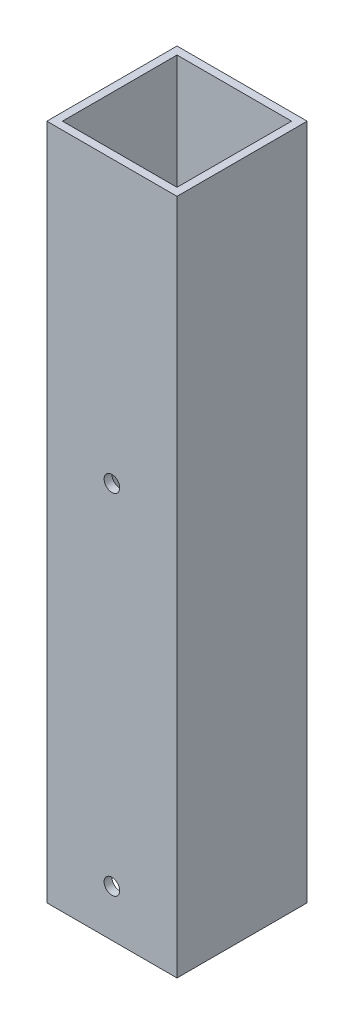
ISO-10303-21;
HEADER;
FILE_DESCRIPTION(('STEP AP214'),'2;1');
FILE_NAME('part.step','',(''),(''),'','','');
FILE_SCHEMA(('AUTOMOTIVE_DESIGN { 1 0 10303 214 1 1 1 1 }'));
ENDSEC;
DATA;
#1=APPLICATION_CONTEXT('core data for automotive mechanical design processes');
#2=APPLICATION_PROTOCOL_DEFINITION('international standard','automotive_design',2000,#1);
#3=PRODUCT_CONTEXT('',#1,'mechanical');
#4=PRODUCT('Part','Part','',(#3));
#5=PRODUCT_RELATED_PRODUCT_CATEGORY('part','',(#4));
#6=PRODUCT_DEFINITION_FORMATION('','',#4);
#7=PRODUCT_DEFINITION_CONTEXT('part definition',#1,'design');
#8=PRODUCT_DEFINITION('design','',#6,#7);
#9=PRODUCT_DEFINITION_SHAPE('','',#8);
#10=(LENGTH_UNIT() NAMED_UNIT(*) SI_UNIT(.MILLI.,.METRE.));
#11=(NAMED_UNIT(*) PLANE_ANGLE_UNIT() SI_UNIT($,.RADIAN.));
#12=(NAMED_UNIT(*) SI_UNIT($,.STERADIAN.) SOLID_ANGLE_UNIT());
#13=UNCERTAINTY_MEASURE_WITH_UNIT(LENGTH_MEASURE(1.E-05),#10,'distance_accuracy_value','');
#14=(GEOMETRIC_REPRESENTATION_CONTEXT(3) GLOBAL_UNCERTAINTY_ASSIGNED_CONTEXT((#13)) GLOBAL_UNIT_ASSIGNED_CONTEXT((#10,
#11,#12)) REPRESENTATION_CONTEXT('',''));
#15=CARTESIAN_POINT('',(0.,0.,0.));
#16=DIRECTION('',(0.,0.,1.));
#17=DIRECTION('',(1.,0.,0.));
#18=AXIS2_PLACEMENT_3D('',#15,#16,#17);
#19=CARTESIAN_POINT('',(12.5,-65.,-12.5));
#20=DIRECTION('',(1.,0.,0.));
#21=DIRECTION('',(0.,0.,-1.));
#22=AXIS2_PLACEMENT_3D('',#19,#20,#21);
#23=PLANE('',#22);
#24=DIRECTION('',(0.,1.,0.));
#25=VECTOR('',#24,1.);
#26=CARTESIAN_POINT('',(12.5,-65.,-12.5));
#27=LINE('',#26,#25);
#28=CARTESIAN_POINT('',(12.5,-65.,-12.5));
#29=VERTEX_POINT('',#28);
#30=CARTESIAN_POINT('',(12.5,65.,-12.5));
#31=VERTEX_POINT('',#30);
#32=EDGE_CURVE('E162',#29,#31,#27,.T.);
#33=ORIENTED_EDGE('',*,*,#32,.T.);
#34=DIRECTION('',(0.,0.,-1.));
#35=VECTOR('',#34,1.);
#36=CARTESIAN_POINT('',(12.5,65.,-12.5));
#37=LINE('',#36,#35);
#38=CARTESIAN_POINT('',(12.5,65.,12.5));
#39=VERTEX_POINT('',#38);
#40=EDGE_CURVE('E130',#39,#31,#37,.T.);
#41=ORIENTED_EDGE('',*,*,#40,.F.);
#42=DIRECTION('',(0.,1.,0.));
#43=VECTOR('',#42,1.);
#44=CARTESIAN_POINT('',(12.5,-65.,12.5));
#45=LINE('',#44,#43);
#46=CARTESIAN_POINT('',(12.5,-65.,12.5));
#47=VERTEX_POINT('',#46);
#48=EDGE_CURVE('E11',#47,#39,#45,.T.);
#49=ORIENTED_EDGE('',*,*,#48,.F.);
#50=DIRECTION('',(0.,0.,-1.));
#51=VECTOR('',#50,1.);
#52=CARTESIAN_POINT('',(12.5,-65.,-12.5));
#53=LINE('',#52,#51);
#54=EDGE_CURVE('E149',#47,#29,#53,.T.);
#55=ORIENTED_EDGE('',*,*,#54,.T.);
#56=EDGE_LOOP('',(#33,#41,#49,#55));
#57=FACE_BOUND('',#56,.T.);
#58=ADVANCED_FACE('F33',(#57),#23,.T.);
#59=CARTESIAN_POINT('',(-12.5,-65.,12.5));
#60=DIRECTION('',(0.,0.,1.));
#61=DIRECTION('',(1.,0.,0.));
#62=AXIS2_PLACEMENT_3D('',#59,#60,#61);
#63=PLANE('',#62);
#64=CARTESIAN_POINT('',(0.,-56.,12.5));
#65=DIRECTION('',(0.,0.,-1.));
#66=DIRECTION('',(-1.,0.,0.));
#67=AXIS2_PLACEMENT_3D('',#64,#65,#66);
#68=CIRCLE('',#67,1.5);
#69=CARTESIAN_POINT('',(-1.5,-56.,12.5));
#70=VERTEX_POINT('',#69);
#71=EDGE_CURVE('E170',#70,#70,#68,.T.);
#72=ORIENTED_EDGE('',*,*,#71,.T.);
#73=EDGE_LOOP('',(#72));
#74=FACE_BOUND('',#73,.T.);
#75=CARTESIAN_POINT('',(0.,11.,12.5));
#76=DIRECTION('',(0.,0.,-1.));
#77=DIRECTION('',(-1.,0.,0.));
#78=AXIS2_PLACEMENT_3D('',#75,#76,#77);
#79=CIRCLE('',#78,1.5);
#80=CARTESIAN_POINT('',(-1.5,11.,12.5));
#81=VERTEX_POINT('',#80);
#82=EDGE_CURVE('E181',#81,#81,#79,.T.);
#83=ORIENTED_EDGE('',*,*,#82,.T.);
#84=EDGE_LOOP('',(#83));
#85=FACE_BOUND('',#84,.T.);
#86=ORIENTED_EDGE('',*,*,#48,.T.);
#87=DIRECTION('',(1.,0.,0.));
#88=VECTOR('',#87,1.);
#89=CARTESIAN_POINT('',(-12.5,65.,12.5));
#90=LINE('',#89,#88);
#91=CARTESIAN_POINT('',(-12.5,65.,12.5));
#92=VERTEX_POINT('',#91);
#93=EDGE_CURVE('E139',#92,#39,#90,.T.);
#94=ORIENTED_EDGE('',*,*,#93,.F.);
#95=DIRECTION('',(0.,1.,0.));
#96=VECTOR('',#95,1.);
#97=CARTESIAN_POINT('',(-12.5,-65.,12.5));
#98=LINE('',#97,#96);
#99=CARTESIAN_POINT('',(-12.5,-65.,12.5));
#100=VERTEX_POINT('',#99);
#101=EDGE_CURVE('E41',#100,#92,#98,.T.);
#102=ORIENTED_EDGE('',*,*,#101,.F.);
#103=DIRECTION('',(1.,0.,0.));
#104=VECTOR('',#103,1.);
#105=CARTESIAN_POINT('',(-12.5,-65.,12.5));
#106=LINE('',#105,#104);
#107=EDGE_CURVE('E160',#100,#47,#106,.T.);
#108=ORIENTED_EDGE('',*,*,#107,.T.);
#109=EDGE_LOOP('',(#86,#94,#102,#108));
#110=FACE_BOUND('',#109,.T.);
#111=ADVANCED_FACE('F212',(#74,#85,#110),#63,.T.);
#112=CARTESIAN_POINT('',(-12.5,-65.,-12.5));
#113=DIRECTION('',(-1.,0.,0.));
#114=DIRECTION('',(0.,0.,1.));
#115=AXIS2_PLACEMENT_3D('',#112,#113,#114);
#116=PLANE('',#115);
#117=ORIENTED_EDGE('',*,*,#101,.T.);
#118=DIRECTION('',(0.,0.,1.));
#119=VECTOR('',#118,1.);
#120=CARTESIAN_POINT('',(-12.5,65.,-12.5));
#121=LINE('',#120,#119);
#122=CARTESIAN_POINT('',(-12.5,65.,-12.5));
#123=VERTEX_POINT('',#122);
#124=EDGE_CURVE('E136',#123,#92,#121,.T.);
#125=ORIENTED_EDGE('',*,*,#124,.F.);
#126=DIRECTION('',(0.,1.,0.));
#127=VECTOR('',#126,1.);
#128=CARTESIAN_POINT('',(-12.5,-65.,-12.5));
#129=LINE('',#128,#127);
#130=CARTESIAN_POINT('',(-12.5,-65.,-12.5));
#131=VERTEX_POINT('',#130);
#132=EDGE_CURVE('E165',#131,#123,#129,.T.);
#133=ORIENTED_EDGE('',*,*,#132,.F.);
#134=DIRECTION('',(0.,0.,1.));
#135=VECTOR('',#134,1.);
#136=CARTESIAN_POINT('',(-12.5,-65.,-12.5));
#137=LINE('',#136,#135);
#138=EDGE_CURVE('E157',#131,#100,#137,.T.);
#139=ORIENTED_EDGE('',*,*,#138,.T.);
#140=EDGE_LOOP('',(#117,#125,#133,#139));
#141=FACE_BOUND('',#140,.T.);
#142=ADVANCED_FACE('F216',(#141),#116,.T.);
#143=CARTESIAN_POINT('',(-12.5,-65.,-12.5));
#144=DIRECTION('',(0.,0.,-1.));
#145=DIRECTION('',(-1.,0.,0.));
#146=AXIS2_PLACEMENT_3D('',#143,#144,#145);
#147=PLANE('',#146);
#148=CARTESIAN_POINT('',(0.,-56.,-12.5));
#149=DIRECTION('',(0.,0.,-1.));
#150=DIRECTION('',(-1.,0.,0.));
#151=AXIS2_PLACEMENT_3D('',#148,#149,#150);
#152=CIRCLE('',#151,1.5);
#153=CARTESIAN_POINT('',(-1.5,-56.,-12.5));
#154=VERTEX_POINT('',#153);
#155=EDGE_CURVE('E176',#154,#154,#152,.T.);
#156=ORIENTED_EDGE('',*,*,#155,.F.);
#157=EDGE_LOOP('',(#156));
#158=FACE_BOUND('',#157,.T.);
#159=CARTESIAN_POINT('',(0.,11.,-12.5));
#160=DIRECTION('',(0.,0.,-1.));
#161=DIRECTION('',(-1.,0.,0.));
#162=AXIS2_PLACEMENT_3D('',#159,#160,#161);
#163=CIRCLE('',#162,1.5);
#164=CARTESIAN_POINT('',(-1.5,11.,-12.5));
#165=VERTEX_POINT('',#164);
#166=EDGE_CURVE('E186',#165,#165,#163,.T.);
#167=ORIENTED_EDGE('',*,*,#166,.F.);
#168=EDGE_LOOP('',(#167));
#169=FACE_BOUND('',#168,.T.);
#170=ORIENTED_EDGE('',*,*,#132,.T.);
#171=DIRECTION('',(-1.,0.,0.));
#172=VECTOR('',#171,1.);
#173=CARTESIAN_POINT('',(-12.5,65.,-12.5));
#174=LINE('',#173,#172);
#175=EDGE_CURVE('E133',#31,#123,#174,.T.);
#176=ORIENTED_EDGE('',*,*,#175,.F.);
#177=ORIENTED_EDGE('',*,*,#32,.F.);
#178=DIRECTION('',(-1.,0.,0.));
#179=VECTOR('',#178,1.);
#180=CARTESIAN_POINT('',(-12.5,-65.,-12.5));
#181=LINE('',#180,#179);
#182=EDGE_CURVE('E154',#29,#131,#181,.T.);
#183=ORIENTED_EDGE('',*,*,#182,.T.);
#184=EDGE_LOOP('',(#170,#176,#177,#183));
#185=FACE_BOUND('',#184,.T.);
#186=ADVANCED_FACE('F221',(#158,#169,#185),#147,.T.);
#187=CARTESIAN_POINT('',(0.,-65.,0.));
#188=DIRECTION('',(0.,1.,0.));
#189=DIRECTION('',(0.,0.,1.));
#190=AXIS2_PLACEMENT_3D('',#187,#188,#189);
#191=PLANE('',#190);
#192=DIRECTION('',(1.,0.,0.));
#193=VECTOR('',#192,1.);
#194=CARTESIAN_POINT('',(-11.,-65.,11.));
#195=LINE('',#194,#193);
#196=CARTESIAN_POINT('',(-11.,-65.,11.));
#197=VERTEX_POINT('',#196);
#198=CARTESIAN_POINT('',(11.,-65.,11.));
#199=VERTEX_POINT('',#198);
#200=EDGE_CURVE('E110',#197,#199,#195,.T.);
#201=ORIENTED_EDGE('',*,*,#200,.T.);
#202=DIRECTION('',(0.,0.,-1.));
#203=VECTOR('',#202,1.);
#204=CARTESIAN_POINT('',(11.,-65.,-11.));
#205=LINE('',#204,#203);
#206=CARTESIAN_POINT('',(11.,-65.,-11.));
#207=VERTEX_POINT('',#206);
#208=EDGE_CURVE('E142',#199,#207,#205,.T.);
#209=ORIENTED_EDGE('',*,*,#208,.T.);
#210=DIRECTION('',(-1.,0.,0.));
#211=VECTOR('',#210,1.);
#212=CARTESIAN_POINT('',(-11.,-65.,-11.));
#213=LINE('',#212,#211);
#214=CARTESIAN_POINT('',(-11.,-65.,-11.));
#215=VERTEX_POINT('',#214);
#216=EDGE_CURVE('E105',#207,#215,#213,.T.);
#217=ORIENTED_EDGE('',*,*,#216,.T.);
#218=DIRECTION('',(0.,0.,1.));
#219=VECTOR('',#218,1.);
#220=CARTESIAN_POINT('',(-11.,-65.,-11.));
#221=LINE('',#220,#219);
#222=EDGE_CURVE('E49',#215,#197,#221,.T.);
#223=ORIENTED_EDGE('',*,*,#222,.T.);
#224=EDGE_LOOP('',(#201,#209,#217,#223));
#225=FACE_BOUND('',#224,.T.);
#226=ORIENTED_EDGE('',*,*,#54,.F.);
#227=ORIENTED_EDGE('',*,*,#107,.F.);
#228=ORIENTED_EDGE('',*,*,#138,.F.);
#229=ORIENTED_EDGE('',*,*,#182,.F.);
#230=EDGE_LOOP('',(#226,#227,#228,#229));
#231=FACE_BOUND('',#230,.T.);
#232=ADVANCED_FACE('F229',(#225,#231),#191,.F.);
#233=CARTESIAN_POINT('',(11.,-65.,-11.));
#234=DIRECTION('',(1.,0.,0.));
#235=DIRECTION('',(0.,0.,-1.));
#236=AXIS2_PLACEMENT_3D('',#233,#234,#235);
#237=PLANE('',#236);
#238=DIRECTION('',(0.,1.,0.));
#239=VECTOR('',#238,1.);
#240=CARTESIAN_POINT('',(11.,-65.,11.));
#241=LINE('',#240,#239);
#242=CARTESIAN_POINT('',(11.,65.,11.));
#243=VERTEX_POINT('',#242);
#244=EDGE_CURVE('E115',#199,#243,#241,.T.);
#245=ORIENTED_EDGE('',*,*,#244,.T.);
#246=DIRECTION('',(0.,0.,-1.));
#247=VECTOR('',#246,1.);
#248=CARTESIAN_POINT('',(11.,65.,-11.));
#249=LINE('',#248,#247);
#250=CARTESIAN_POINT('',(11.,65.,-11.));
#251=VERTEX_POINT('',#250);
#252=EDGE_CURVE('E113',#243,#251,#249,.T.);
#253=ORIENTED_EDGE('',*,*,#252,.T.);
#254=DIRECTION('',(0.,1.,0.));
#255=VECTOR('',#254,1.);
#256=CARTESIAN_POINT('',(11.,-65.,-11.));
#257=LINE('',#256,#255);
#258=EDGE_CURVE('E98',#207,#251,#257,.T.);
#259=ORIENTED_EDGE('',*,*,#258,.F.);
#260=ORIENTED_EDGE('',*,*,#208,.F.);
#261=EDGE_LOOP('',(#245,#253,#259,#260));
#262=FACE_BOUND('',#261,.T.);
#263=ADVANCED_FACE('F114',(#262),#237,.F.);
#264=CARTESIAN_POINT('',(-11.,-65.,11.));
#265=DIRECTION('',(0.,0.,1.));
#266=DIRECTION('',(1.,0.,0.));
#267=AXIS2_PLACEMENT_3D('',#264,#265,#266);
#268=PLANE('',#267);
#269=CARTESIAN_POINT('',(0.,-56.,11.));
#270=DIRECTION('',(0.,0.,1.));
#271=DIRECTION('',(1.,0.,0.));
#272=AXIS2_PLACEMENT_3D('',#269,#270,#271);
#273=CIRCLE('',#272,1.5);
#274=CARTESIAN_POINT('',(1.5,-56.,11.));
#275=VERTEX_POINT('',#274);
#276=EDGE_CURVE('E119',#275,#275,#273,.T.);
#277=ORIENTED_EDGE('',*,*,#276,.T.);
#278=EDGE_LOOP('',(#277));
#279=FACE_BOUND('',#278,.T.);
#280=CARTESIAN_POINT('',(0.,11.,11.));
#281=DIRECTION('',(0.,0.,1.));
#282=DIRECTION('',(1.,0.,0.));
#283=AXIS2_PLACEMENT_3D('',#280,#281,#282);
#284=CIRCLE('',#283,1.5);
#285=CARTESIAN_POINT('',(1.5,11.,11.));
#286=VERTEX_POINT('',#285);
#287=EDGE_CURVE('E169',#286,#286,#284,.T.);
#288=ORIENTED_EDGE('',*,*,#287,.T.);
#289=EDGE_LOOP('',(#288));
#290=FACE_BOUND('',#289,.T.);
#291=DIRECTION('',(0.,1.,0.));
#292=VECTOR('',#291,1.);
#293=CARTESIAN_POINT('',(-11.,-65.,11.));
#294=LINE('',#293,#292);
#295=CARTESIAN_POINT('',(-11.,65.,11.));
#296=VERTEX_POINT('',#295);
#297=EDGE_CURVE('E150',#197,#296,#294,.T.);
#298=ORIENTED_EDGE('',*,*,#297,.T.);
#299=DIRECTION('',(1.,0.,0.));
#300=VECTOR('',#299,1.);
#301=CARTESIAN_POINT('',(-11.,65.,11.));
#302=LINE('',#301,#300);
#303=EDGE_CURVE('E125',#296,#243,#302,.T.);
#304=ORIENTED_EDGE('',*,*,#303,.T.);
#305=ORIENTED_EDGE('',*,*,#244,.F.);
#306=ORIENTED_EDGE('',*,*,#200,.F.);
#307=EDGE_LOOP('',(#298,#304,#305,#306));
#308=FACE_BOUND('',#307,.T.);
#309=ADVANCED_FACE('F243',(#279,#290,#308),#268,.F.);
#310=CARTESIAN_POINT('',(-11.,-65.,-11.));
#311=DIRECTION('',(-1.,0.,0.));
#312=DIRECTION('',(0.,0.,1.));
#313=AXIS2_PLACEMENT_3D('',#310,#311,#312);
#314=PLANE('',#313);
#315=DIRECTION('',(0.,1.,0.));
#316=VECTOR('',#315,1.);
#317=CARTESIAN_POINT('',(-11.,-65.,-11.));
#318=LINE('',#317,#316);
#319=CARTESIAN_POINT('',(-11.,65.,-11.));
#320=VERTEX_POINT('',#319);
#321=EDGE_CURVE('E109',#215,#320,#318,.T.);
#322=ORIENTED_EDGE('',*,*,#321,.T.);
#323=DIRECTION('',(0.,0.,1.));
#324=VECTOR('',#323,1.);
#325=CARTESIAN_POINT('',(-11.,65.,-11.));
#326=LINE('',#325,#324);
#327=EDGE_CURVE('E123',#320,#296,#326,.T.);
#328=ORIENTED_EDGE('',*,*,#327,.T.);
#329=ORIENTED_EDGE('',*,*,#297,.F.);
#330=ORIENTED_EDGE('',*,*,#222,.F.);
#331=EDGE_LOOP('',(#322,#328,#329,#330));
#332=FACE_BOUND('',#331,.T.);
#333=ADVANCED_FACE('F246',(#332),#314,.F.);
#334=CARTESIAN_POINT('',(-11.,-65.,-11.));
#335=DIRECTION('',(0.,0.,-1.));
#336=DIRECTION('',(-1.,0.,0.));
#337=AXIS2_PLACEMENT_3D('',#334,#335,#336);
#338=PLANE('',#337);
#339=CARTESIAN_POINT('',(0.,-56.,-11.));
#340=DIRECTION('',(0.,0.,-1.));
#341=DIRECTION('',(-1.,0.,0.));
#342=AXIS2_PLACEMENT_3D('',#339,#340,#341);
#343=CIRCLE('',#342,1.5);
#344=CARTESIAN_POINT('',(-1.5,-56.,-11.));
#345=VERTEX_POINT('',#344);
#346=EDGE_CURVE('E36',#345,#345,#343,.T.);
#347=ORIENTED_EDGE('',*,*,#346,.T.);
#348=EDGE_LOOP('',(#347));
#349=FACE_BOUND('',#348,.T.);
#350=CARTESIAN_POINT('',(0.,11.,-11.));
#351=DIRECTION('',(0.,0.,-1.));
#352=DIRECTION('',(-1.,0.,0.));
#353=AXIS2_PLACEMENT_3D('',#350,#351,#352);
#354=CIRCLE('',#353,1.5);
#355=CARTESIAN_POINT('',(-1.5,11.,-11.));
#356=VERTEX_POINT('',#355);
#357=EDGE_CURVE('E167',#356,#356,#354,.T.);
#358=ORIENTED_EDGE('',*,*,#357,.T.);
#359=EDGE_LOOP('',(#358));
#360=FACE_BOUND('',#359,.T.);
#361=ORIENTED_EDGE('',*,*,#258,.T.);
#362=DIRECTION('',(-1.,0.,0.));
#363=VECTOR('',#362,1.);
#364=CARTESIAN_POINT('',(-11.,65.,-11.));
#365=LINE('',#364,#363);
#366=EDGE_CURVE('E102',#251,#320,#365,.T.);
#367=ORIENTED_EDGE('',*,*,#366,.T.);
#368=ORIENTED_EDGE('',*,*,#321,.F.);
#369=ORIENTED_EDGE('',*,*,#216,.F.);
#370=EDGE_LOOP('',(#361,#367,#368,#369));
#371=FACE_BOUND('',#370,.T.);
#372=ADVANCED_FACE('F100',(#349,#360,#371),#338,.F.);
#373=CARTESIAN_POINT('',(0.,65.,0.));
#374=DIRECTION('',(0.,1.,0.));
#375=DIRECTION('',(0.,0.,1.));
#376=AXIS2_PLACEMENT_3D('',#373,#374,#375);
#377=PLANE('',#376);
#378=ORIENTED_EDGE('',*,*,#40,.T.);
#379=ORIENTED_EDGE('',*,*,#175,.T.);
#380=ORIENTED_EDGE('',*,*,#124,.T.);
#381=ORIENTED_EDGE('',*,*,#93,.T.);
#382=EDGE_LOOP('',(#378,#379,#380,#381));
#383=FACE_BOUND('',#382,.T.);
#384=ORIENTED_EDGE('',*,*,#366,.F.);
#385=ORIENTED_EDGE('',*,*,#252,.F.);
#386=ORIENTED_EDGE('',*,*,#303,.F.);
#387=ORIENTED_EDGE('',*,*,#327,.F.);
#388=EDGE_LOOP('',(#384,#385,#386,#387));
#389=FACE_BOUND('',#388,.T.);
#390=ADVANCED_FACE('F121',(#383,#389),#377,.T.);
#391=CARTESIAN_POINT('',(0.,11.,12.5));
#392=DIRECTION('',(0.,0.,-1.));
#393=DIRECTION('',(-1.,0.,0.));
#394=AXIS2_PLACEMENT_3D('',#391,#392,#393);
#395=CYLINDRICAL_SURFACE('',#394,1.5);
#396=ORIENTED_EDGE('',*,*,#166,.T.);
#397=EDGE_LOOP('',(#396));
#398=FACE_BOUND('',#397,.T.);
#399=ORIENTED_EDGE('',*,*,#357,.F.);
#400=EDGE_LOOP('',(#399));
#401=FACE_BOUND('',#400,.T.);
#402=ADVANCED_FACE('F198',(#398,#401),#395,.F.);
#403=CARTESIAN_POINT('',(0.,-56.,12.5));
#404=DIRECTION('',(0.,0.,-1.));
#405=DIRECTION('',(-1.,0.,0.));
#406=AXIS2_PLACEMENT_3D('',#403,#404,#405);
#407=CYLINDRICAL_SURFACE('',#406,1.5);
#408=ORIENTED_EDGE('',*,*,#155,.T.);
#409=EDGE_LOOP('',(#408));
#410=FACE_BOUND('',#409,.T.);
#411=ORIENTED_EDGE('',*,*,#346,.F.);
#412=EDGE_LOOP('',(#411));
#413=FACE_BOUND('',#412,.T.);
#414=ADVANCED_FACE('F195',(#410,#413),#407,.F.);
#415=ORIENTED_EDGE('',*,*,#82,.F.);
#416=EDGE_LOOP('',(#415));
#417=FACE_BOUND('',#416,.T.);
#418=ORIENTED_EDGE('',*,*,#287,.F.);
#419=EDGE_LOOP('',(#418));
#420=FACE_BOUND('',#419,.T.);
#421=ADVANCED_FACE('F197',(#417,#420),#395,.F.);
#422=ORIENTED_EDGE('',*,*,#71,.F.);
#423=EDGE_LOOP('',(#422));
#424=FACE_BOUND('',#423,.T.);
#425=ORIENTED_EDGE('',*,*,#276,.F.);
#426=EDGE_LOOP('',(#425));
#427=FACE_BOUND('',#426,.T.);
#428=ADVANCED_FACE('F201',(#424,#427),#407,.F.);
#429=CLOSED_SHELL('',(#58,#111,#142,#186,#232,#263,#309,#333,#372,#390,#402,#414,#421,#428));
#430=MANIFOLD_SOLID_BREP('B2',#429);
#431=ADVANCED_BREP_SHAPE_REPRESENTATION('',(#18,#430),#14);
#432=SHAPE_DEFINITION_REPRESENTATION(#9,#431);
ENDSEC;
END-ISO-10303-21;
